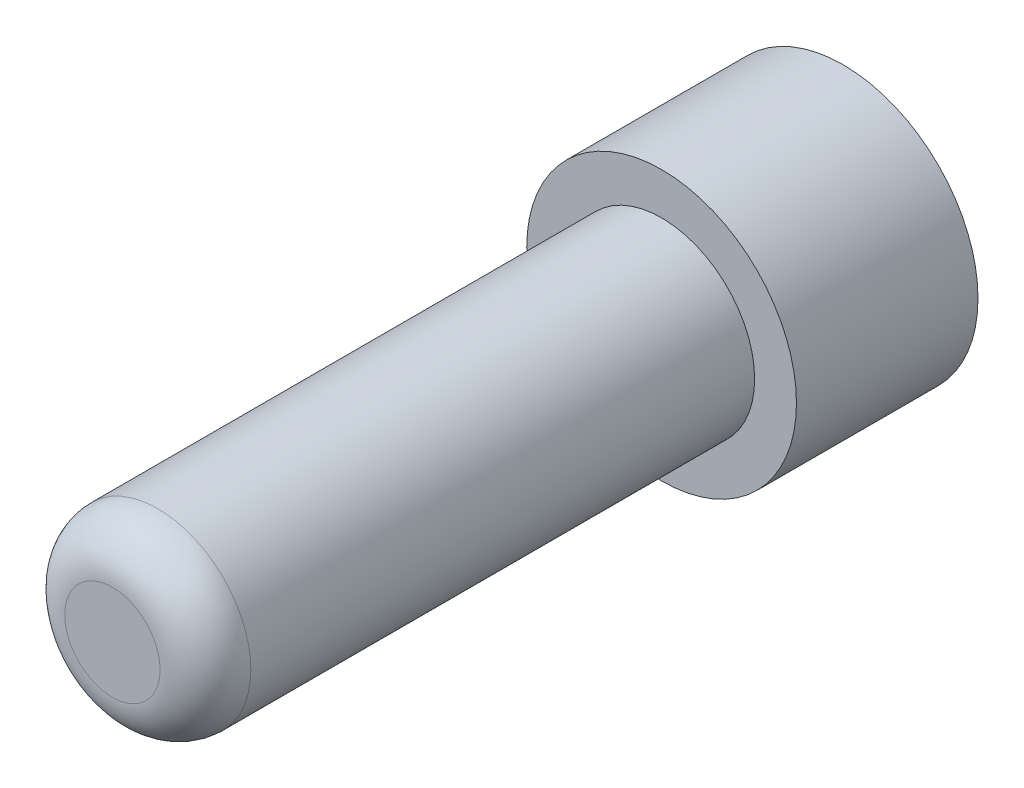
ISO-10303-21;
HEADER;
FILE_DESCRIPTION(('STEP AP214'),'2;1');
FILE_NAME('part.step','',(''),(''),'','','');
FILE_SCHEMA(('AUTOMOTIVE_DESIGN { 1 0 10303 214 1 1 1 1 }'));
ENDSEC;
DATA;
#1=APPLICATION_CONTEXT('core data for automotive mechanical design processes');
#2=APPLICATION_PROTOCOL_DEFINITION('international standard','automotive_design',2000,#1);
#3=PRODUCT_CONTEXT('',#1,'mechanical');
#4=PRODUCT('Part','Part','',(#3));
#5=PRODUCT_RELATED_PRODUCT_CATEGORY('part','',(#4));
#6=PRODUCT_DEFINITION_FORMATION('','',#4);
#7=PRODUCT_DEFINITION_CONTEXT('part definition',#1,'design');
#8=PRODUCT_DEFINITION('design','',#6,#7);
#9=PRODUCT_DEFINITION_SHAPE('','',#8);
#10=(LENGTH_UNIT() NAMED_UNIT(*) SI_UNIT(.MILLI.,.METRE.));
#11=(NAMED_UNIT(*) PLANE_ANGLE_UNIT() SI_UNIT($,.RADIAN.));
#12=(NAMED_UNIT(*) SI_UNIT($,.STERADIAN.) SOLID_ANGLE_UNIT());
#13=UNCERTAINTY_MEASURE_WITH_UNIT(LENGTH_MEASURE(1.E-05),#10,'distance_accuracy_value','');
#14=(GEOMETRIC_REPRESENTATION_CONTEXT(3) GLOBAL_UNCERTAINTY_ASSIGNED_CONTEXT((#13)) GLOBAL_UNIT_ASSIGNED_CONTEXT((#10,
#11,#12)) REPRESENTATION_CONTEXT('',''));
#15=CARTESIAN_POINT('',(0.,0.,0.));
#16=DIRECTION('',(0.,0.,1.));
#17=DIRECTION('',(1.,0.,0.));
#18=AXIS2_PLACEMENT_3D('',#15,#16,#17);
#19=CARTESIAN_POINT('',(0.,0.,-20.4470000000001));
#20=DIRECTION('',(0.,0.,1.));
#21=DIRECTION('',(1.00000000000001,0.,0.));
#22=AXIS2_PLACEMENT_3D('',#19,#20,#21);
#23=PLANE('',#22);
#24=CARTESIAN_POINT('',(0.,0.,-20.4470000000001));
#25=DIRECTION('',(0.,0.,1.));
#26=DIRECTION('',(1.00000000000001,0.,0.));
#27=AXIS2_PLACEMENT_3D('',#24,#25,#26);
#28=CIRCLE('',#27,7.54722471910113);
#29=CARTESIAN_POINT('',(7.54722471910123,0.,-20.4470000000001));
#30=VERTEX_POINT('',#29);
#31=EDGE_CURVE('E54',#30,#30,#28,.T.);
#32=ORIENTED_EDGE('',*,*,#31,.F.);
#33=EDGE_LOOP('',(#32));
#34=FACE_BOUND('',#33,.T.);
#35=ADVANCED_FACE('F41',(#34),#23,.F.);
#36=CARTESIAN_POINT('',(0.,0.,26.9905917602997));
#37=DIRECTION('',(0.,0.,1.));
#38=DIRECTION('',(1.00000000000001,0.,0.));
#39=AXIS2_PLACEMENT_3D('',#36,#37,#38);
#40=CYLINDRICAL_SURFACE('',#39,7.54722471910113);
#41=CARTESIAN_POINT('',(0.,0.,-10.2869999999999));
#42=DIRECTION('',(0.,0.,1.));
#43=DIRECTION('',(1.00000000000001,0.,0.));
#44=AXIS2_PLACEMENT_3D('',#41,#42,#43);
#45=CIRCLE('',#44,7.54722471910113);
#46=CARTESIAN_POINT('',(7.54722471910123,0.,-10.2869999999999));
#47=VERTEX_POINT('',#46);
#48=EDGE_CURVE('E62',#47,#47,#45,.T.);
#49=ORIENTED_EDGE('',*,*,#48,.F.);
#50=EDGE_LOOP('',(#49));
#51=FACE_BOUND('',#50,.T.);
#52=ORIENTED_EDGE('',*,*,#31,.T.);
#53=EDGE_LOOP('',(#52));
#54=FACE_BOUND('',#53,.T.);
#55=ADVANCED_FACE('F79',(#51,#54),#40,.T.);
#56=CARTESIAN_POINT('',(0.,7.54722471909908,-10.2869999999999));
#57=DIRECTION('',(0.,0.,-1.));
#58=DIRECTION('',(-1.00000000000001,0.,0.));
#59=AXIS2_PLACEMENT_3D('',#56,#57,#58);
#60=PLANE('',#59);
#61=CARTESIAN_POINT('',(0.,0.,-10.2869999999999));
#62=DIRECTION('',(0.,0.,1.));
#63=DIRECTION('',(1.00000000000001,0.,0.));
#64=AXIS2_PLACEMENT_3D('',#61,#62,#63);
#65=CIRCLE('',#64,5.207);
#66=CARTESIAN_POINT('',(5.20700000000007,0.,-10.2869999999999));
#67=VERTEX_POINT('',#66);
#68=EDGE_CURVE('E70',#67,#67,#65,.T.);
#69=ORIENTED_EDGE('',*,*,#68,.F.);
#70=EDGE_LOOP('',(#69));
#71=FACE_BOUND('',#70,.T.);
#72=ORIENTED_EDGE('',*,*,#48,.T.);
#73=EDGE_LOOP('',(#72));
#74=FACE_BOUND('',#73,.T.);
#75=ADVANCED_FACE('F73',(#71,#74),#60,.F.);
#76=CARTESIAN_POINT('',(0.,0.,26.9905917602997));
#77=DIRECTION('',(0.,0.,1.));
#78=DIRECTION('',(1.00000000000001,0.,0.));
#79=AXIS2_PLACEMENT_3D('',#76,#77,#78);
#80=CYLINDRICAL_SURFACE('',#79,5.207);
#81=CARTESIAN_POINT('',(0.,0.,17.9069999999999));
#82=DIRECTION('',(0.,0.,-1.));
#83=DIRECTION('',(-1.00000000000001,0.,0.));
#84=AXIS2_PLACEMENT_3D('',#81,#82,#83);
#85=CIRCLE('',#84,5.207);
#86=CARTESIAN_POINT('',(-5.20700000000007,0.,17.9069999999999));
#87=VERTEX_POINT('',#86);
#88=EDGE_CURVE('E10',#87,#87,#85,.T.);
#89=ORIENTED_EDGE('',*,*,#88,.T.);
#90=EDGE_LOOP('',(#89));
#91=FACE_BOUND('',#90,.T.);
#92=ORIENTED_EDGE('',*,*,#68,.T.);
#93=EDGE_LOOP('',(#92));
#94=FACE_BOUND('',#93,.T.);
#95=ADVANCED_FACE('F71',(#91,#94),#80,.T.);
#96=CARTESIAN_POINT('',(1.55431223447522E-12,5.20699999999896,20.4470000000001));
#97=DIRECTION('',(0.,0.,-1.));
#98=DIRECTION('',(-1.00000000000001,0.,0.));
#99=AXIS2_PLACEMENT_3D('',#96,#97,#98);
#100=PLANE('',#99);
#101=CARTESIAN_POINT('',(0.,0.,20.4470000000001));
#102=DIRECTION('',(0.,0.,-1.));
#103=DIRECTION('',(-1.00000000000001,0.,0.));
#104=AXIS2_PLACEMENT_3D('',#101,#102,#103);
#105=CIRCLE('',#104,2.667);
#106=CARTESIAN_POINT('',(-2.66700000000004,0.,20.4470000000001));
#107=VERTEX_POINT('',#106);
#108=EDGE_CURVE('E47',#107,#107,#105,.F.);
#109=ORIENTED_EDGE('',*,*,#108,.T.);
#110=EDGE_LOOP('',(#109));
#111=FACE_BOUND('',#110,.T.);
#112=ADVANCED_FACE('F94',(#111),#100,.F.);
#113=CARTESIAN_POINT('',(0.,0.,17.9069999999999));
#114=DIRECTION('',(0.,0.,-1.));
#115=DIRECTION('',(-1.00000000000001,0.,0.));
#116=AXIS2_PLACEMENT_3D('',#113,#114,#115);
#117=TOROIDAL_SURFACE('',#116,2.667,2.54);
#118=ORIENTED_EDGE('',*,*,#88,.F.);
#119=EDGE_LOOP('',(#118));
#120=FACE_BOUND('',#119,.T.);
#121=ORIENTED_EDGE('',*,*,#108,.F.);
#122=EDGE_LOOP('',(#121));
#123=FACE_BOUND('',#122,.T.);
#124=ADVANCED_FACE('F43',(#120,#123),#117,.T.);
#125=CLOSED_SHELL('',(#35,#55,#75,#95,#112,#124));
#126=MANIFOLD_SOLID_BREP('B2',#125);
#127=ADVANCED_BREP_SHAPE_REPRESENTATION('',(#18,#126),#14);
#128=SHAPE_DEFINITION_REPRESENTATION(#9,#127);
ENDSEC;
END-ISO-10303-21;
